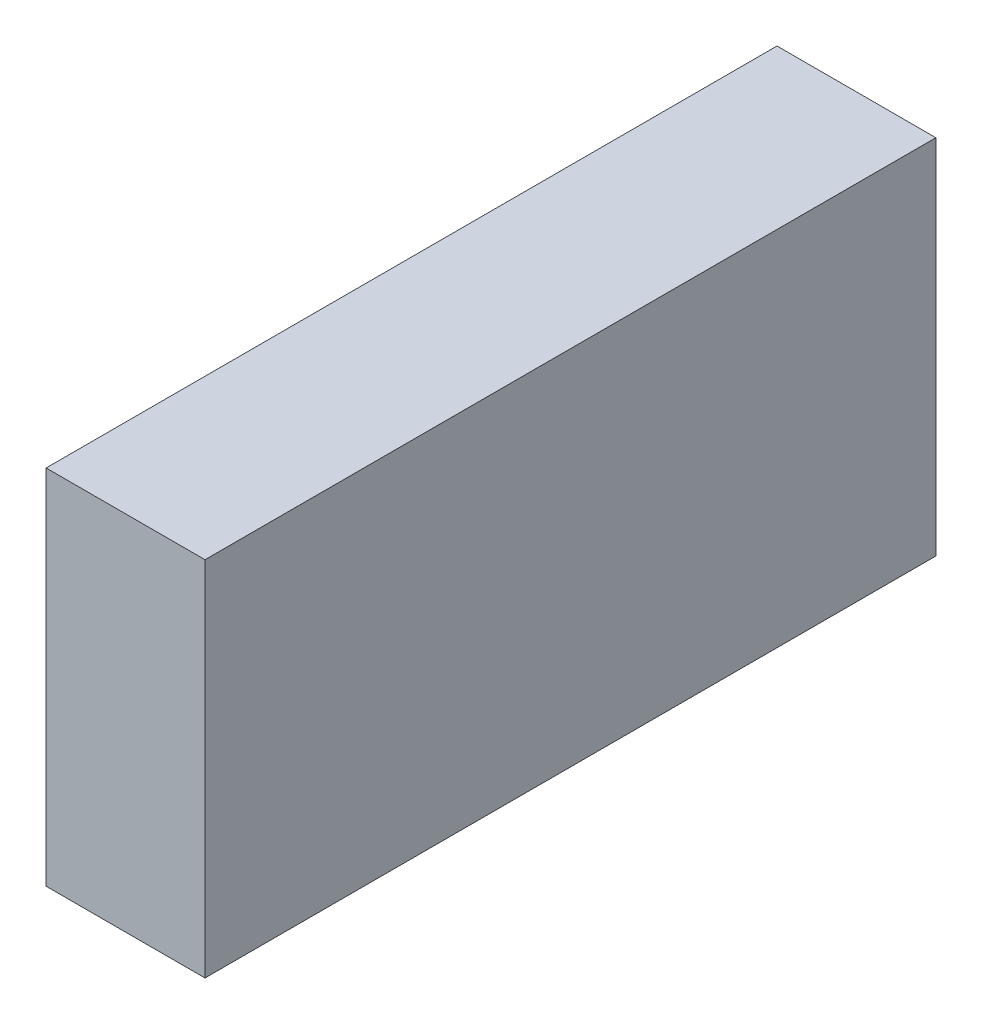
ISO-10303-21;
HEADER;
FILE_DESCRIPTION(('STEP AP214'),'2;1');
FILE_NAME('part.step','',(''),(''),'','','');
FILE_SCHEMA(('AUTOMOTIVE_DESIGN { 1 0 10303 214 1 1 1 1 }'));
ENDSEC;
DATA;
#1=APPLICATION_CONTEXT('core data for automotive mechanical design processes');
#2=APPLICATION_PROTOCOL_DEFINITION('international standard','automotive_design',2000,#1);
#3=PRODUCT_CONTEXT('',#1,'mechanical');
#4=PRODUCT('Part','Part','',(#3));
#5=PRODUCT_RELATED_PRODUCT_CATEGORY('part','',(#4));
#6=PRODUCT_DEFINITION_FORMATION('','',#4);
#7=PRODUCT_DEFINITION_CONTEXT('part definition',#1,'design');
#8=PRODUCT_DEFINITION('design','',#6,#7);
#9=PRODUCT_DEFINITION_SHAPE('','',#8);
#10=(LENGTH_UNIT() NAMED_UNIT(*) SI_UNIT(.MILLI.,.METRE.));
#11=(NAMED_UNIT(*) PLANE_ANGLE_UNIT() SI_UNIT($,.RADIAN.));
#12=(NAMED_UNIT(*) SI_UNIT($,.STERADIAN.) SOLID_ANGLE_UNIT());
#13=UNCERTAINTY_MEASURE_WITH_UNIT(LENGTH_MEASURE(1.E-05),#10,'distance_accuracy_value','');
#14=(GEOMETRIC_REPRESENTATION_CONTEXT(3) GLOBAL_UNCERTAINTY_ASSIGNED_CONTEXT((#13)) GLOBAL_UNIT_ASSIGNED_CONTEXT((#10,
#11,#12)) REPRESENTATION_CONTEXT('',''));
#15=CARTESIAN_POINT('',(0.,0.,0.));
#16=DIRECTION('',(0.,0.,1.));
#17=DIRECTION('',(1.,0.,0.));
#18=AXIS2_PLACEMENT_3D('',#15,#16,#17);
#19=CARTESIAN_POINT('',(0.,0.,230.));
#20=DIRECTION('',(1.,0.,0.));
#21=DIRECTION('',(0.,0.,-1.));
#22=AXIS2_PLACEMENT_3D('',#19,#20,#21);
#23=PLANE('',#22);
#24=DIRECTION('',(0.,-1.,0.));
#25=VECTOR('',#24,1.);
#26=CARTESIAN_POINT('',(0.,0.,0.));
#27=LINE('',#26,#25);
#28=CARTESIAN_POINT('',(0.,114.,0.));
#29=VERTEX_POINT('',#28);
#30=CARTESIAN_POINT('',(0.,0.,0.));
#31=VERTEX_POINT('',#30);
#32=EDGE_CURVE('E97',#29,#31,#27,.T.);
#33=ORIENTED_EDGE('',*,*,#32,.T.);
#34=DIRECTION('',(0.,0.,-1.));
#35=VECTOR('',#34,1.);
#36=CARTESIAN_POINT('',(0.,0.,230.));
#37=LINE('',#36,#35);
#38=CARTESIAN_POINT('',(0.,0.,230.));
#39=VERTEX_POINT('',#38);
#40=EDGE_CURVE('E11',#39,#31,#37,.T.);
#41=ORIENTED_EDGE('',*,*,#40,.F.);
#42=DIRECTION('',(0.,-1.,0.));
#43=VECTOR('',#42,1.);
#44=CARTESIAN_POINT('',(0.,0.,230.));
#45=LINE('',#44,#43);
#46=CARTESIAN_POINT('',(0.,114.,230.));
#47=VERTEX_POINT('',#46);
#48=EDGE_CURVE('E85',#47,#39,#45,.T.);
#49=ORIENTED_EDGE('',*,*,#48,.F.);
#50=DIRECTION('',(0.,0.,-1.));
#51=VECTOR('',#50,1.);
#52=CARTESIAN_POINT('',(0.,114.,230.));
#53=LINE('',#52,#51);
#54=EDGE_CURVE('E93',#47,#29,#53,.T.);
#55=ORIENTED_EDGE('',*,*,#54,.T.);
#56=EDGE_LOOP('',(#33,#41,#49,#55));
#57=FACE_BOUND('',#56,.T.);
#58=ADVANCED_FACE('F34',(#57),#23,.F.);
#59=CARTESIAN_POINT('',(0.,0.,230.));
#60=DIRECTION('',(0.,1.,0.));
#61=DIRECTION('',(0.,0.,1.));
#62=AXIS2_PLACEMENT_3D('',#59,#60,#61);
#63=PLANE('',#62);
#64=DIRECTION('',(1.,0.,0.));
#65=VECTOR('',#64,1.);
#66=CARTESIAN_POINT('',(0.,0.,0.));
#67=LINE('',#66,#65);
#68=CARTESIAN_POINT('',(50.,0.,0.));
#69=VERTEX_POINT('',#68);
#70=EDGE_CURVE('E89',#31,#69,#67,.T.);
#71=ORIENTED_EDGE('',*,*,#70,.T.);
#72=DIRECTION('',(0.,0.,-1.));
#73=VECTOR('',#72,1.);
#74=CARTESIAN_POINT('',(50.,0.,230.));
#75=LINE('',#74,#73);
#76=CARTESIAN_POINT('',(50.,0.,230.));
#77=VERTEX_POINT('',#76);
#78=EDGE_CURVE('E42',#77,#69,#75,.T.);
#79=ORIENTED_EDGE('',*,*,#78,.F.);
#80=DIRECTION('',(1.,0.,0.));
#81=VECTOR('',#80,1.);
#82=CARTESIAN_POINT('',(0.,0.,230.));
#83=LINE('',#82,#81);
#84=EDGE_CURVE('E80',#39,#77,#83,.T.);
#85=ORIENTED_EDGE('',*,*,#84,.F.);
#86=ORIENTED_EDGE('',*,*,#40,.T.);
#87=EDGE_LOOP('',(#71,#79,#85,#86));
#88=FACE_BOUND('',#87,.T.);
#89=ADVANCED_FACE('F88',(#88),#63,.F.);
#90=CARTESIAN_POINT('',(50.,0.,230.));
#91=DIRECTION('',(-1.,0.,0.));
#92=DIRECTION('',(0.,0.,1.));
#93=AXIS2_PLACEMENT_3D('',#90,#91,#92);
#94=PLANE('',#93);
#95=DIRECTION('',(0.,1.,0.));
#96=VECTOR('',#95,1.);
#97=CARTESIAN_POINT('',(50.,0.,0.));
#98=LINE('',#97,#96);
#99=CARTESIAN_POINT('',(50.,114.,0.));
#100=VERTEX_POINT('',#99);
#101=EDGE_CURVE('E67',#69,#100,#98,.T.);
#102=ORIENTED_EDGE('',*,*,#101,.T.);
#103=DIRECTION('',(0.,0.,-1.));
#104=VECTOR('',#103,1.);
#105=CARTESIAN_POINT('',(50.,114.,230.));
#106=LINE('',#105,#104);
#107=CARTESIAN_POINT('',(50.,114.,230.));
#108=VERTEX_POINT('',#107);
#109=EDGE_CURVE('E90',#108,#100,#106,.T.);
#110=ORIENTED_EDGE('',*,*,#109,.F.);
#111=DIRECTION('',(0.,1.,0.));
#112=VECTOR('',#111,1.);
#113=CARTESIAN_POINT('',(50.,0.,230.));
#114=LINE('',#113,#112);
#115=EDGE_CURVE('E83',#77,#108,#114,.T.);
#116=ORIENTED_EDGE('',*,*,#115,.F.);
#117=ORIENTED_EDGE('',*,*,#78,.T.);
#118=EDGE_LOOP('',(#102,#110,#116,#117));
#119=FACE_BOUND('',#118,.T.);
#120=ADVANCED_FACE('F91',(#119),#94,.F.);
#121=CARTESIAN_POINT('',(0.,114.,230.));
#122=DIRECTION('',(0.,-1.,0.));
#123=DIRECTION('',(0.,0.,-1.));
#124=AXIS2_PLACEMENT_3D('',#121,#122,#123);
#125=PLANE('',#124);
#126=DIRECTION('',(-1.,0.,0.));
#127=VECTOR('',#126,1.);
#128=CARTESIAN_POINT('',(0.,114.,0.));
#129=LINE('',#128,#127);
#130=EDGE_CURVE('E73',#100,#29,#129,.T.);
#131=ORIENTED_EDGE('',*,*,#130,.T.);
#132=ORIENTED_EDGE('',*,*,#54,.F.);
#133=DIRECTION('',(-1.,0.,0.));
#134=VECTOR('',#133,1.);
#135=CARTESIAN_POINT('',(0.,114.,230.));
#136=LINE('',#135,#134);
#137=EDGE_CURVE('E50',#108,#47,#136,.T.);
#138=ORIENTED_EDGE('',*,*,#137,.F.);
#139=ORIENTED_EDGE('',*,*,#109,.T.);
#140=EDGE_LOOP('',(#131,#132,#138,#139));
#141=FACE_BOUND('',#140,.T.);
#142=ADVANCED_FACE('F104',(#141),#125,.F.);
#143=CARTESIAN_POINT('',(0.,0.,230.));
#144=DIRECTION('',(0.,0.,-1.));
#145=DIRECTION('',(-1.,0.,0.));
#146=AXIS2_PLACEMENT_3D('',#143,#144,#145);
#147=PLANE('',#146);
#148=ORIENTED_EDGE('',*,*,#48,.T.);
#149=ORIENTED_EDGE('',*,*,#84,.T.);
#150=ORIENTED_EDGE('',*,*,#115,.T.);
#151=ORIENTED_EDGE('',*,*,#137,.T.);
#152=EDGE_LOOP('',(#148,#149,#150,#151));
#153=FACE_BOUND('',#152,.T.);
#154=ADVANCED_FACE('F81',(#153),#147,.F.);
#155=CARTESIAN_POINT('',(0.,0.,0.));
#156=DIRECTION('',(0.,0.,-1.));
#157=DIRECTION('',(-1.,0.,0.));
#158=AXIS2_PLACEMENT_3D('',#155,#156,#157);
#159=PLANE('',#158);
#160=ORIENTED_EDGE('',*,*,#32,.F.);
#161=ORIENTED_EDGE('',*,*,#130,.F.);
#162=ORIENTED_EDGE('',*,*,#101,.F.);
#163=ORIENTED_EDGE('',*,*,#70,.F.);
#164=EDGE_LOOP('',(#160,#161,#162,#163));
#165=FACE_BOUND('',#164,.T.);
#166=ADVANCED_FACE('F107',(#165),#159,.T.);
#167=CLOSED_SHELL('',(#58,#89,#120,#142,#154,#166));
#168=MANIFOLD_SOLID_BREP('B2',#167);
#169=ADVANCED_BREP_SHAPE_REPRESENTATION('',(#18,#168),#14);
#170=SHAPE_DEFINITION_REPRESENTATION(#9,#169);
ENDSEC;
END-ISO-10303-21;
